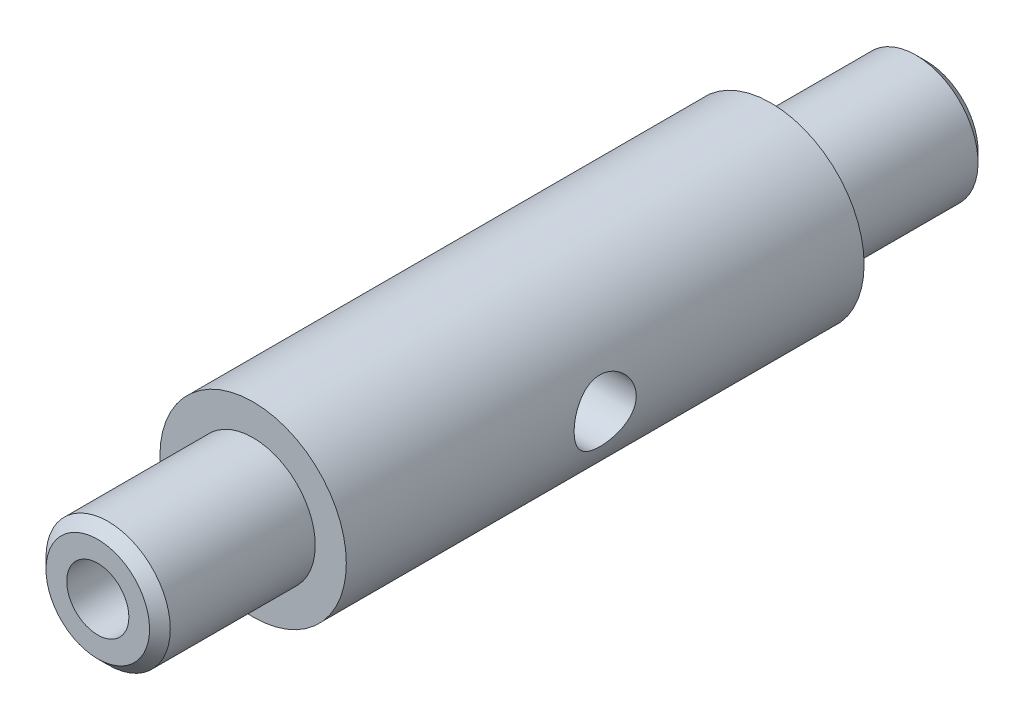
ISO-10303-21;
HEADER;
FILE_DESCRIPTION(('STEP AP214'),'2;1');
FILE_NAME('part.step','',(''),(''),'','','');
FILE_SCHEMA(('AUTOMOTIVE_DESIGN { 1 0 10303 214 1 1 1 1 }'));
ENDSEC;
DATA;
#1=APPLICATION_CONTEXT('core data for automotive mechanical design processes');
#2=APPLICATION_PROTOCOL_DEFINITION('international standard','automotive_design',2000,#1);
#3=PRODUCT_CONTEXT('',#1,'mechanical');
#4=PRODUCT('Part','Part','',(#3));
#5=PRODUCT_RELATED_PRODUCT_CATEGORY('part','',(#4));
#6=PRODUCT_DEFINITION_FORMATION('','',#4);
#7=PRODUCT_DEFINITION_CONTEXT('part definition',#1,'design');
#8=PRODUCT_DEFINITION('design','',#6,#7);
#9=PRODUCT_DEFINITION_SHAPE('','',#8);
#10=(LENGTH_UNIT() NAMED_UNIT(*) SI_UNIT(.MILLI.,.METRE.));
#11=(NAMED_UNIT(*) PLANE_ANGLE_UNIT() SI_UNIT($,.RADIAN.));
#12=(NAMED_UNIT(*) SI_UNIT($,.STERADIAN.) SOLID_ANGLE_UNIT());
#13=UNCERTAINTY_MEASURE_WITH_UNIT(LENGTH_MEASURE(1.E-05),#10,'distance_accuracy_value','');
#14=(GEOMETRIC_REPRESENTATION_CONTEXT(3) GLOBAL_UNCERTAINTY_ASSIGNED_CONTEXT((#13)) GLOBAL_UNIT_ASSIGNED_CONTEXT((#10,
#11,#12)) REPRESENTATION_CONTEXT('',''));
#15=CARTESIAN_POINT('',(0.,0.,0.));
#16=DIRECTION('',(0.,0.,1.));
#17=DIRECTION('',(1.,0.,0.));
#18=AXIS2_PLACEMENT_3D('',#15,#16,#17);
#19=CARTESIAN_POINT('',(0.,0.,0.));
#20=DIRECTION('',(0.,0.,1.));
#21=DIRECTION('',(1.,0.,0.));
#22=AXIS2_PLACEMENT_3D('',#19,#20,#21);
#23=CYLINDRICAL_SURFACE('',#22,3.00000000000001);
#24=CARTESIAN_POINT('',(0.,0.,0.));
#25=DIRECTION('',(0.,0.,1.));
#26=DIRECTION('',(1.,0.,0.));
#27=AXIS2_PLACEMENT_3D('',#24,#25,#26);
#28=CIRCLE('',#27,3.00000000000001);
#29=CARTESIAN_POINT('',(3.00000000000001,0.,0.));
#30=VERTEX_POINT('',#29);
#31=EDGE_CURVE('E155',#30,#30,#28,.T.);
#32=ORIENTED_EDGE('',*,*,#31,.T.);
#33=EDGE_LOOP('',(#32));
#34=FACE_BOUND('',#33,.T.);
#35=CARTESIAN_POINT('',(0.,0.,-40.));
#36=DIRECTION('',(-0.707106781186547,0.,0.707106781186547));
#37=DIRECTION('',(0.707106781186547,0.,0.707106781186547));
#38=AXIS2_PLACEMENT_3D('',#35,#36,#37);
#39=ELLIPSE('',#38,4.24264068711929,3.00000000000001);
#40=CARTESIAN_POINT('',(0.,3.00000000000001,-40.));
#41=VERTEX_POINT('',#40);
#42=CARTESIAN_POINT('',(0.,-3.00000000000001,-40.));
#43=VERTEX_POINT('',#42);
#44=EDGE_CURVE('E56',#41,#43,#39,.F.);
#45=ORIENTED_EDGE('',*,*,#44,.T.);
#46=CARTESIAN_POINT('',(0.,0.,-40.));
#47=DIRECTION('',(0.707106781186547,0.,0.707106781186547));
#48=DIRECTION('',(-0.707106781186547,0.,0.707106781186547));
#49=AXIS2_PLACEMENT_3D('',#46,#47,#48);
#50=ELLIPSE('',#49,4.24264068711929,3.00000000000001);
#51=EDGE_CURVE('E64',#43,#41,#50,.F.);
#52=ORIENTED_EDGE('',*,*,#51,.T.);
#53=EDGE_LOOP('',(#45,#52));
#54=FACE_BOUND('',#53,.T.);
#55=ADVANCED_FACE('F41',(#34,#54),#23,.F.);
#56=CARTESIAN_POINT('',(0.,0.,0.));
#57=DIRECTION('',(0.,0.,1.));
#58=DIRECTION('',(0.,-1.,0.));
#59=AXIS2_PLACEMENT_3D('',#56,#57,#58);
#60=PLANE('',#59);
#61=CARTESIAN_POINT('',(0.,0.,0.));
#62=DIRECTION('',(0.,0.,1.));
#63=DIRECTION('',(0.,-1.,0.));
#64=AXIS2_PLACEMENT_3D('',#61,#62,#63);
#65=CIRCLE('',#64,5.00000000000001);
#66=CARTESIAN_POINT('',(0.,-5.00000000000001,0.));
#67=VERTEX_POINT('',#66);
#68=EDGE_CURVE('E11',#67,#67,#65,.T.);
#69=ORIENTED_EDGE('',*,*,#68,.T.);
#70=EDGE_LOOP('',(#69));
#71=FACE_BOUND('',#70,.T.);
#72=ORIENTED_EDGE('',*,*,#31,.F.);
#73=EDGE_LOOP('',(#72));
#74=FACE_BOUND('',#73,.T.);
#75=ADVANCED_FACE('F98',(#71,#74),#60,.T.);
#76=CARTESIAN_POINT('',(0.,0.,-80.));
#77=DIRECTION('',(0.,0.,-1.));
#78=DIRECTION('',(0.,1.,0.));
#79=AXIS2_PLACEMENT_3D('',#76,#77,#78);
#80=CYLINDRICAL_SURFACE('',#79,6.);
#81=CARTESIAN_POINT('',(0.,0.,-0.999999999999987));
#82=DIRECTION('',(0.,0.,1.));
#83=DIRECTION('',(0.,-1.,0.));
#84=AXIS2_PLACEMENT_3D('',#81,#82,#83);
#85=CIRCLE('',#84,6.);
#86=CARTESIAN_POINT('',(0.,-6.,-0.999999999999987));
#87=VERTEX_POINT('',#86);
#88=EDGE_CURVE('E50',#87,#87,#85,.F.);
#89=ORIENTED_EDGE('',*,*,#88,.T.);
#90=EDGE_LOOP('',(#89));
#91=FACE_BOUND('',#90,.T.);
#92=CARTESIAN_POINT('',(0.,0.,-15.));
#93=DIRECTION('',(0.,0.,-1.));
#94=DIRECTION('',(0.,1.,0.));
#95=AXIS2_PLACEMENT_3D('',#92,#93,#94);
#96=CIRCLE('',#95,6.);
#97=CARTESIAN_POINT('',(0.,6.,-15.));
#98=VERTEX_POINT('',#97);
#99=EDGE_CURVE('E71',#98,#98,#96,.T.);
#100=ORIENTED_EDGE('',*,*,#99,.F.);
#101=EDGE_LOOP('',(#100));
#102=FACE_BOUND('',#101,.T.);
#103=ADVANCED_FACE('F86',(#91,#102),#80,.T.);
#104=CARTESIAN_POINT('',(0.,6.,-15.));
#105=DIRECTION('',(0.,0.,1.));
#106=DIRECTION('',(0.,-1.,0.));
#107=AXIS2_PLACEMENT_3D('',#104,#105,#106);
#108=PLANE('',#107);
#109=ORIENTED_EDGE('',*,*,#99,.T.);
#110=EDGE_LOOP('',(#109));
#111=FACE_BOUND('',#110,.T.);
#112=CARTESIAN_POINT('',(0.,0.,-15.));
#113=DIRECTION('',(0.,0.,-1.));
#114=DIRECTION('',(0.,1.,0.));
#115=AXIS2_PLACEMENT_3D('',#112,#113,#114);
#116=CIRCLE('',#115,8.99999999999999);
#117=CARTESIAN_POINT('',(0.,8.99999999999999,-15.));
#118=VERTEX_POINT('',#117);
#119=EDGE_CURVE('E167',#118,#118,#116,.T.);
#120=ORIENTED_EDGE('',*,*,#119,.F.);
#121=EDGE_LOOP('',(#120));
#122=FACE_BOUND('',#121,.T.);
#123=ADVANCED_FACE('F139',(#111,#122),#108,.T.);
#124=CARTESIAN_POINT('',(0.,0.,-80.));
#125=DIRECTION('',(0.,0.,-1.));
#126=DIRECTION('',(0.,1.,0.));
#127=AXIS2_PLACEMENT_3D('',#124,#125,#126);
#128=CYLINDRICAL_SURFACE('',#127,8.99999999999999);
#129=CARTESIAN_POINT('',(-8.99999999999999,0.,-43.));
#130=CARTESIAN_POINT('',(-9.00000045902831,-0.16369008866017,-43.0000007611949));
#131=CARTESIAN_POINT('',(-8.99549308522634,-0.32737558361565,-42.9865592016184));
#132=CARTESIAN_POINT('',(-8.97795630609841,-0.649925282618917,-42.9333126735484));
#133=CARTESIAN_POINT('',(-8.96492601606457,-0.808788984356453,-42.8935049681532));
#134=CARTESIAN_POINT('',(-8.93175923719327,-1.11699836850533,-42.7890422698479));
#135=CARTESIAN_POINT('',(-8.91163463192559,-1.2663594776581,-42.7244288126222));
#136=CARTESIAN_POINT('',(-8.86633337152024,-1.55212481041597,-42.572376481485));
#137=CARTESIAN_POINT('',(-8.84115572003333,-1.68852647087612,-42.4849331049922));
#138=CARTESIAN_POINT('',(-8.78742283329014,-1.9492250250668,-42.2865225854237));
#139=CARTESIAN_POINT('',(-8.75878669391354,-2.07301110089493,-42.1749062972185));
#140=CARTESIAN_POINT('',(-8.70180944349364,-2.30049807810625,-41.9326985358803));
#141=CARTESIAN_POINT('',(-8.67346839871647,-2.40419455646839,-41.8021028952145));
#142=CARTESIAN_POINT('',(-8.61939997431821,-2.59147482668358,-41.5210446544106));
#143=CARTESIAN_POINT('',(-8.59377117827064,-2.67439457466309,-41.3701187808036));
#144=CARTESIAN_POINT('',(-8.54925916255802,-2.81345662163316,-41.0554717166244));
#145=CARTESIAN_POINT('',(-8.53037388482236,-2.8696070921603,-40.8917544485118));
#146=CARTESIAN_POINT('',(-8.50233909808131,-2.95162038452749,-40.5619803355099));
#147=CARTESIAN_POINT('',(-8.49288287308833,-2.97844034481531,-40.3961883745328));
#148=CARTESIAN_POINT('',(-8.48386969888522,-3.00402337000343,-40.0622087375324));
#149=CARTESIAN_POINT('',(-8.48430969068189,-3.00279510481416,-39.8940218178724));
#150=CARTESIAN_POINT('',(-8.4947704502454,-2.97305971111026,-39.5681901086679));
#151=CARTESIAN_POINT('',(-8.50435247602598,-2.94580173950099,-39.4104147912429));
#152=CARTESIAN_POINT('',(-8.53129973173652,-2.86681848854825,-39.1018197411795));
#153=CARTESIAN_POINT('',(-8.54866589352322,-2.81509027977562,-38.9510008436948));
#154=CARTESIAN_POINT('',(-8.58953733393745,-2.68781717418063,-38.6577617512256));
#155=CARTESIAN_POINT('',(-8.61313697379351,-2.61190214612179,-38.5155159235914));
#156=CARTESIAN_POINT('',(-8.66377675727179,-2.43866731890942,-38.2453872751608));
#157=CARTESIAN_POINT('',(-8.6908178937139,-2.34134133709202,-38.1175086191999));
#158=CARTESIAN_POINT('',(-8.74701987503222,-2.12204799804671,-37.8727252055177));
#159=CARTESIAN_POINT('',(-8.77621768064528,-1.99905945022894,-37.7567419164728));
#160=CARTESIAN_POINT('',(-8.83220815161109,-1.73501870991019,-37.5468062000098));
#161=CARTESIAN_POINT('',(-8.85900058614201,-1.59396478698245,-37.4528558855065));
#162=CARTESIAN_POINT('',(-8.9075132381338,-1.29584283913881,-37.2889110992948));
#163=CARTESIAN_POINT('',(-8.92918050024117,-1.13862982924901,-37.2191635259778));
#164=CARTESIAN_POINT('',(-8.96461701433304,-0.813807250093526,-37.1073904781329));
#165=CARTESIAN_POINT('',(-8.97838900964637,-0.646201314464865,-37.0653553737297));
#166=CARTESIAN_POINT('',(-8.9960288121432,-0.313151488587916,-37.0118330019329));
#167=CARTESIAN_POINT('',(-9.00030005501183,-0.147928799594542,-36.9991005724817));
#168=CARTESIAN_POINT('',(-8.99966708084481,0.18232520988071,-37.0009980207954));
#169=CARTESIAN_POINT('',(-8.99476441258086,0.34735655795895,-37.0156232799396));
#170=CARTESIAN_POINT('',(-8.97660074151312,0.667559598912767,-37.0708357232079));
#171=CARTESIAN_POINT('',(-8.96358596133576,0.822878420504531,-37.1106586181485));
#172=CARTESIAN_POINT('',(-8.93075540490209,1.12456787573872,-37.2141803334002));
#173=CARTESIAN_POINT('',(-8.91093876140024,1.27093736552582,-37.2778821984034));
#174=CARTESIAN_POINT('',(-8.86586793861868,1.55486488917982,-37.4292112955224));
#175=CARTESIAN_POINT('',(-8.84048444267357,1.69208987765144,-37.5174237798495));
#176=CARTESIAN_POINT('',(-8.78715761748787,1.95019449040676,-37.7145824500404));
#177=CARTESIAN_POINT('',(-8.75921350781482,2.07106910338673,-37.8235349680953));
#178=CARTESIAN_POINT('',(-8.70230543941333,2.2987575234189,-38.0649362530198));
#179=CARTESIAN_POINT('',(-8.67335283262283,2.40468290773731,-38.1982276807806));
#180=CARTESIAN_POINT('',(-8.61899919884125,2.59277256697072,-38.4813147034327));
#181=CARTESIAN_POINT('',(-8.59359820146006,2.67493664379304,-38.6311104359022));
#182=CARTESIAN_POINT('',(-8.5494717537415,2.81279079124909,-38.9430190458697));
#183=CARTESIAN_POINT('',(-8.53073282378936,2.86853439649506,-39.1051062375063));
#184=CARTESIAN_POINT('',(-8.50232496919348,2.95168400027807,-39.4371359501324));
#185=CARTESIAN_POINT('',(-8.49265195870917,2.97910276486182,-39.607074896213));
#186=CARTESIAN_POINT('',(-8.48393576622531,3.00382884743203,-39.9405912881227));
#187=CARTESIAN_POINT('',(-8.48437200772245,3.0026107719252,-40.1040470208605));
#188=CARTESIAN_POINT('',(-8.49453809471601,2.97372688034608,-40.4282952247662));
#189=CARTESIAN_POINT('',(-8.50426738708084,2.94606263837576,-40.5890878538653));
#190=CARTESIAN_POINT('',(-8.53153572914674,2.86611543938804,-40.9004069890074));
#191=CARTESIAN_POINT('',(-8.54892294067432,2.81431003804654,-41.0510704750135));
#192=CARTESIAN_POINT('',(-8.58949196455405,2.68793809727924,-41.3416822208148));
#193=CARTESIAN_POINT('',(-8.61267506290179,2.61336650566142,-41.481628093564));
#194=CARTESIAN_POINT('',(-8.66348487678138,2.43978207775029,-41.7534510097687));
#195=CARTESIAN_POINT('',(-8.6912613492641,2.33984472829374,-41.8847095056952));
#196=CARTESIAN_POINT('',(-8.74750068849758,2.11992864940694,-42.1290694401526));
#197=CARTESIAN_POINT('',(-8.77596374737116,1.99994425335444,-42.2421657270642));
#198=CARTESIAN_POINT('',(-8.83170091576632,1.73772467076206,-42.4514332368675));
#199=CARTESIAN_POINT('',(-8.85888545403769,1.59480454049919,-42.546773043253));
#200=CARTESIAN_POINT('',(-8.90777973517835,1.29407207221988,-42.7119712865519));
#201=CARTESIAN_POINT('',(-8.92949087723789,1.13626355439705,-42.7818362377661));
#202=CARTESIAN_POINT('',(-8.96416545205625,0.817480941602931,-42.891164897466));
#203=CARTESIAN_POINT('',(-8.97747637267567,0.656963273029229,-42.9318473987901));
#204=CARTESIAN_POINT('',(-8.99539221192664,0.330961248030742,-42.9862608420314));
#205=CARTESIAN_POINT('',(-8.99999953595714,0.16547827670624,-42.9999992304896));
#206=CARTESIAN_POINT('',(-8.99999999999999,0.,-43.));
#207=B_SPLINE_CURVE_WITH_KNOTS('',3,(#129,#130,#131,#132,#133,#134,#135,#136,#137,#138,#139,
#140,#141,#142,#143,#144,#145,#146,#147,#148,#149,#150,#151,#152,#153,#154,#155,#156,#157,#158,
#159,#160,#161,#162,#163,#164,#165,#166,#167,#168,#169,#170,#171,#172,#173,#174,#175,#176,#177,
#178,#179,#180,#181,#182,#183,#184,#185,#186,#187,#188,#189,#190,#191,#192,#193,#194,#195,#196,
#197,#198,#199,#200,#201,#202,#203,#204,#205,#206),.UNSPECIFIED.,.T.,.F.,(4,2,2,2,2,2,2,2,2,2,2,
2,2,2,2,2,2,2,2,2,2,2,2,2,2,2,2,2,2,2,2,2,2,2,2,2,2,2,4),(0.,0.490461318078033,
0.980973555802562,1.47066801861082,1.9604591333973,2.46554052848268,2.97073299862591,
3.49045154470411,4.010011340785,4.51205777225521,5.01394901962457,5.49290479653841,
5.97191792566446,6.45864513465392,6.94551307674622,7.45779917434101,7.97013437899855,
8.48755216951073,9.00479006631625,9.49960749525509,9.9943413949253,10.4747447393464,
10.9552093585231,11.4483119953121,11.9415654246567,12.4572306864226,12.9729002470499,
13.4875204148031,14.0019085411752,14.4898699819278,14.9778023805413,15.4564676124125,
15.9352391452793,16.4349020007542,16.9347063337134,17.453989825053,17.9731404345737,
18.4690967512144,18.9649159811442),.UNSPECIFIED.);
#208=CARTESIAN_POINT('',(-8.99999999999999,0.,-43.));
#209=VERTEX_POINT('',#208);
#210=EDGE_CURVE('E149',#209,#209,#207,.T.);
#211=ORIENTED_EDGE('',*,*,#210,.F.);
#212=EDGE_LOOP('',(#211));
#213=FACE_BOUND('',#212,.T.);
#214=CARTESIAN_POINT('',(8.99999999999999,0.,-43.));
#215=CARTESIAN_POINT('',(9.00000045902831,0.163690088660169,-43.0000007611949));
#216=CARTESIAN_POINT('',(8.99549308522634,0.32737558361565,-42.9865592016184));
#217=CARTESIAN_POINT('',(8.97795630609841,0.649925282618916,-42.9333126735484));
#218=CARTESIAN_POINT('',(8.96492601606457,0.808788984356453,-42.8935049681532));
#219=CARTESIAN_POINT('',(8.93175923719327,1.11699836850533,-42.7890422698479));
#220=CARTESIAN_POINT('',(8.91163463192559,1.2663594776581,-42.7244288126222));
#221=CARTESIAN_POINT('',(8.86633337152024,1.55212481041597,-42.572376481485));
#222=CARTESIAN_POINT('',(8.84115572003333,1.68852647087612,-42.4849331049922));
#223=CARTESIAN_POINT('',(8.78742283329014,1.9492250250668,-42.2865225854237));
#224=CARTESIAN_POINT('',(8.75878669391354,2.07301110089493,-42.1749062972185));
#225=CARTESIAN_POINT('',(8.70180944349364,2.30049807810625,-41.9326985358803));
#226=CARTESIAN_POINT('',(8.67346839871647,2.40419455646839,-41.8021028952145));
#227=CARTESIAN_POINT('',(8.61939997431821,2.59147482668358,-41.5210446544106));
#228=CARTESIAN_POINT('',(8.59377117827064,2.67439457466309,-41.3701187808036));
#229=CARTESIAN_POINT('',(8.54925916255802,2.81345662163316,-41.0554717166244));
#230=CARTESIAN_POINT('',(8.53037388482236,2.8696070921603,-40.8917544485118));
#231=CARTESIAN_POINT('',(8.50233909808131,2.95162038452749,-40.5619803355099));
#232=CARTESIAN_POINT('',(8.49288287308833,2.97844034481531,-40.3961883745328));
#233=CARTESIAN_POINT('',(8.48386969888522,3.00402337000343,-40.0622087375324));
#234=CARTESIAN_POINT('',(8.48430969068189,3.00279510481416,-39.8940218178724));
#235=CARTESIAN_POINT('',(8.4947704502454,2.97305971111026,-39.5681901086679));
#236=CARTESIAN_POINT('',(8.50435247602598,2.94580173950099,-39.4104147912429));
#237=CARTESIAN_POINT('',(8.53129973173652,2.86681848854825,-39.1018197411795));
#238=CARTESIAN_POINT('',(8.54866589352322,2.81509027977562,-38.9510008436948));
#239=CARTESIAN_POINT('',(8.58953733393745,2.68781717418063,-38.6577617512256));
#240=CARTESIAN_POINT('',(8.61313697379351,2.61190214612179,-38.5155159235914));
#241=CARTESIAN_POINT('',(8.66377675727179,2.43866731890942,-38.2453872751608));
#242=CARTESIAN_POINT('',(8.6908178937139,2.34134133709202,-38.1175086191999));
#243=CARTESIAN_POINT('',(8.74701987503222,2.12204799804671,-37.8727252055177));
#244=CARTESIAN_POINT('',(8.77621768064528,1.99905945022894,-37.7567419164728));
#245=CARTESIAN_POINT('',(8.83220815161109,1.73501870991019,-37.5468062000098));
#246=CARTESIAN_POINT('',(8.85900058614201,1.59396478698245,-37.4528558855065));
#247=CARTESIAN_POINT('',(8.9075132381338,1.29584283913881,-37.2889110992948));
#248=CARTESIAN_POINT('',(8.92918050024117,1.13862982924901,-37.2191635259778));
#249=CARTESIAN_POINT('',(8.96461701433304,0.813807250093527,-37.1073904781329));
#250=CARTESIAN_POINT('',(8.97838900964637,0.646201314464866,-37.0653553737297));
#251=CARTESIAN_POINT('',(8.9960288121432,0.313151488587917,-37.0118330019329));
#252=CARTESIAN_POINT('',(9.00030005501183,0.147928799594542,-36.9991005724817));
#253=CARTESIAN_POINT('',(8.99966708084481,-0.18232520988071,-37.0009980207954));
#254=CARTESIAN_POINT('',(8.99476441258086,-0.34735655795895,-37.0156232799396));
#255=CARTESIAN_POINT('',(8.97660074151312,-0.667559598912766,-37.0708357232079));
#256=CARTESIAN_POINT('',(8.96358596133576,-0.822878420504531,-37.1106586181485));
#257=CARTESIAN_POINT('',(8.93075540490209,-1.12456787573872,-37.2141803334002));
#258=CARTESIAN_POINT('',(8.91093876140025,-1.27093736552582,-37.2778821984034));
#259=CARTESIAN_POINT('',(8.86586793861869,-1.55486488917982,-37.4292112955224));
#260=CARTESIAN_POINT('',(8.84048444267357,-1.69208987765144,-37.5174237798495));
#261=CARTESIAN_POINT('',(8.78715761748787,-1.95019449040676,-37.7145824500404));
#262=CARTESIAN_POINT('',(8.75921350781482,-2.07106910338673,-37.8235349680953));
#263=CARTESIAN_POINT('',(8.70230543941333,-2.2987575234189,-38.0649362530198));
#264=CARTESIAN_POINT('',(8.67335283262283,-2.40468290773731,-38.1982276807806));
#265=CARTESIAN_POINT('',(8.61899919884125,-2.59277256697072,-38.4813147034327));
#266=CARTESIAN_POINT('',(8.59359820146006,-2.67493664379304,-38.6311104359022));
#267=CARTESIAN_POINT('',(8.5494717537415,-2.81279079124909,-38.9430190458697));
#268=CARTESIAN_POINT('',(8.53073282378936,-2.86853439649506,-39.1051062375063));
#269=CARTESIAN_POINT('',(8.50232496919348,-2.95168400027807,-39.4371359501324));
#270=CARTESIAN_POINT('',(8.49265195870917,-2.97910276486182,-39.607074896213));
#271=CARTESIAN_POINT('',(8.48393576622531,-3.00382884743203,-39.9405912881227));
#272=CARTESIAN_POINT('',(8.48437200772245,-3.0026107719252,-40.1040470208605));
#273=CARTESIAN_POINT('',(8.49453809471601,-2.97372688034608,-40.4282952247662));
#274=CARTESIAN_POINT('',(8.50426738708084,-2.94606263837576,-40.5890878538653));
#275=CARTESIAN_POINT('',(8.53153572914674,-2.86611543938804,-40.9004069890074));
#276=CARTESIAN_POINT('',(8.54892294067432,-2.81431003804654,-41.0510704750135));
#277=CARTESIAN_POINT('',(8.58949196455405,-2.68793809727924,-41.3416822208148));
#278=CARTESIAN_POINT('',(8.61267506290179,-2.61336650566142,-41.481628093564));
#279=CARTESIAN_POINT('',(8.66348487678138,-2.43978207775029,-41.7534510097687));
#280=CARTESIAN_POINT('',(8.6912613492641,-2.33984472829374,-41.8847095056952));
#281=CARTESIAN_POINT('',(8.74750068849758,-2.11992864940694,-42.1290694401526));
#282=CARTESIAN_POINT('',(8.77596374737116,-1.99994425335444,-42.2421657270642));
#283=CARTESIAN_POINT('',(8.83170091576632,-1.73772467076206,-42.4514332368675));
#284=CARTESIAN_POINT('',(8.85888545403769,-1.59480454049918,-42.546773043253));
#285=CARTESIAN_POINT('',(8.90777973517835,-1.29407207221987,-42.711971286552));
#286=CARTESIAN_POINT('',(8.92949087723789,-1.13626355439704,-42.7818362377661));
#287=CARTESIAN_POINT('',(8.96416545205625,-0.817480941602926,-42.891164897466));
#288=CARTESIAN_POINT('',(8.97747637267567,-0.656963273029224,-42.9318473987901));
#289=CARTESIAN_POINT('',(8.99539221192664,-0.33096124803074,-42.9862608420314));
#290=CARTESIAN_POINT('',(8.99999953595714,-0.165478276706239,-42.9999992304896));
#291=CARTESIAN_POINT('',(8.99999999999999,0.,-43.));
#292=B_SPLINE_CURVE_WITH_KNOTS('',3,(#214,#215,#216,#217,#218,#219,#220,#221,#222,#223,#224,
#225,#226,#227,#228,#229,#230,#231,#232,#233,#234,#235,#236,#237,#238,#239,#240,#241,#242,#243,
#244,#245,#246,#247,#248,#249,#250,#251,#252,#253,#254,#255,#256,#257,#258,#259,#260,#261,#262,
#263,#264,#265,#266,#267,#268,#269,#270,#271,#272,#273,#274,#275,#276,#277,#278,#279,#280,#281,
#282,#283,#284,#285,#286,#287,#288,#289,#290,#291),.UNSPECIFIED.,.T.,.F.,(4,2,2,2,2,2,2,2,2,2,2,
2,2,2,2,2,2,2,2,2,2,2,2,2,2,2,2,2,2,2,2,2,2,2,2,2,2,2,4),(0.,0.490461318078033,
0.980973555802562,1.47066801861082,1.9604591333973,2.46554052848268,2.97073299862591,
3.49045154470411,4.010011340785,4.51205777225521,5.01394901962457,5.49290479653841,
5.97191792566446,6.45864513465392,6.94551307674622,7.45779917434101,7.97013437899855,
8.48755216951073,9.00479006631625,9.49960749525509,9.9943413949253,10.4747447393464,
10.9552093585231,11.4483119953121,11.9415654246567,12.4572306864226,12.9729002470499,
13.4875204148031,14.0019085411752,14.4898699819277,14.9778023805413,15.4564676124125,
15.9352391452793,16.4349020007541,16.9347063337134,17.453989825053,17.9731404345737,
18.4690967512144,18.9649159811442),.UNSPECIFIED.);
#293=CARTESIAN_POINT('',(8.99999999999999,0.,-43.));
#294=VERTEX_POINT('',#293);
#295=EDGE_CURVE('E144',#294,#294,#292,.T.);
#296=ORIENTED_EDGE('',*,*,#295,.F.);
#297=EDGE_LOOP('',(#296));
#298=FACE_BOUND('',#297,.T.);
#299=ORIENTED_EDGE('',*,*,#119,.T.);
#300=EDGE_LOOP('',(#299));
#301=FACE_BOUND('',#300,.T.);
#302=CARTESIAN_POINT('',(0.,0.,-65.));
#303=DIRECTION('',(0.,0.,-1.));
#304=DIRECTION('',(0.,1.,0.));
#305=AXIS2_PLACEMENT_3D('',#302,#303,#304);
#306=CIRCLE('',#305,8.99999999999999);
#307=CARTESIAN_POINT('',(0.,8.99999999999999,-65.));
#308=VERTEX_POINT('',#307);
#309=EDGE_CURVE('E164',#308,#308,#306,.T.);
#310=ORIENTED_EDGE('',*,*,#309,.F.);
#311=EDGE_LOOP('',(#310));
#312=FACE_BOUND('',#311,.T.);
#313=ADVANCED_FACE('F135',(#213,#298,#301,#312),#128,.T.);
#314=CARTESIAN_POINT('',(0.,8.99999999999999,-65.));
#315=DIRECTION('',(0.,0.,-1.));
#316=DIRECTION('',(0.,1.,0.));
#317=AXIS2_PLACEMENT_3D('',#314,#315,#316);
#318=PLANE('',#317);
#319=ORIENTED_EDGE('',*,*,#309,.T.);
#320=EDGE_LOOP('',(#319));
#321=FACE_BOUND('',#320,.T.);
#322=CARTESIAN_POINT('',(0.,0.,-65.));
#323=DIRECTION('',(0.,0.,-1.));
#324=DIRECTION('',(0.,1.,0.));
#325=AXIS2_PLACEMENT_3D('',#322,#323,#324);
#326=CIRCLE('',#325,6.);
#327=CARTESIAN_POINT('',(0.,6.,-65.));
#328=VERTEX_POINT('',#327);
#329=EDGE_CURVE('E161',#328,#328,#326,.T.);
#330=ORIENTED_EDGE('',*,*,#329,.F.);
#331=EDGE_LOOP('',(#330));
#332=FACE_BOUND('',#331,.T.);
#333=ADVANCED_FACE('F132',(#321,#332),#318,.T.);
#334=CARTESIAN_POINT('',(0.,0.,-80.));
#335=DIRECTION('',(0.,0.,-1.));
#336=DIRECTION('',(0.,1.,0.));
#337=AXIS2_PLACEMENT_3D('',#334,#335,#336);
#338=CYLINDRICAL_SURFACE('',#337,6.);
#339=CARTESIAN_POINT('',(0.,0.,-79.));
#340=DIRECTION('',(0.,0.,-1.));
#341=DIRECTION('',(0.,1.,0.));
#342=AXIS2_PLACEMENT_3D('',#339,#340,#341);
#343=CIRCLE('',#342,6.);
#344=CARTESIAN_POINT('',(0.,6.,-79.));
#345=VERTEX_POINT('',#344);
#346=EDGE_CURVE('E81',#345,#345,#343,.F.);
#347=ORIENTED_EDGE('',*,*,#346,.T.);
#348=EDGE_LOOP('',(#347));
#349=FACE_BOUND('',#348,.T.);
#350=ORIENTED_EDGE('',*,*,#329,.T.);
#351=EDGE_LOOP('',(#350));
#352=FACE_BOUND('',#351,.T.);
#353=ADVANCED_FACE('F128',(#349,#352),#338,.T.);
#354=CARTESIAN_POINT('',(0.,6.,-80.));
#355=DIRECTION('',(0.,0.,-1.));
#356=DIRECTION('',(0.,1.,0.));
#357=AXIS2_PLACEMENT_3D('',#354,#355,#356);
#358=PLANE('',#357);
#359=CARTESIAN_POINT('',(0.,0.,-80.));
#360=DIRECTION('',(0.,0.,-1.));
#361=DIRECTION('',(0.,1.,0.));
#362=AXIS2_PLACEMENT_3D('',#359,#360,#361);
#363=CIRCLE('',#362,4.99999999999998);
#364=CARTESIAN_POINT('',(0.,4.99999999999998,-80.));
#365=VERTEX_POINT('',#364);
#366=EDGE_CURVE('E73',#365,#365,#363,.T.);
#367=ORIENTED_EDGE('',*,*,#366,.T.);
#368=EDGE_LOOP('',(#367));
#369=FACE_BOUND('',#368,.T.);
#370=ADVANCED_FACE('F122',(#369),#358,.T.);
#371=CARTESIAN_POINT('',(-8.99999999999999,0.,-40.));
#372=DIRECTION('',(1.,0.,0.));
#373=DIRECTION('',(0.,0.,-1.));
#374=AXIS2_PLACEMENT_3D('',#371,#372,#373);
#375=CYLINDRICAL_SURFACE('',#374,3.);
#376=ORIENTED_EDGE('',*,*,#295,.T.);
#377=EDGE_LOOP('',(#376));
#378=FACE_BOUND('',#377,.T.);
#379=ORIENTED_EDGE('',*,*,#44,.F.);
#380=CARTESIAN_POINT('',(0.,0.,-40.));
#381=DIRECTION('',(0.707106781186547,0.,0.707106781186547));
#382=DIRECTION('',(-0.707106781186547,0.,0.707106781186547));
#383=AXIS2_PLACEMENT_3D('',#380,#381,#382);
#384=ELLIPSE('',#383,4.24264068711929,3.00000000000001);
#385=EDGE_CURVE('E67',#43,#41,#384,.T.);
#386=ORIENTED_EDGE('',*,*,#385,.F.);
#387=EDGE_LOOP('',(#379,#386));
#388=FACE_BOUND('',#387,.T.);
#389=ADVANCED_FACE('F70',(#378,#388),#375,.F.);
#390=CARTESIAN_POINT('',(0.,0.,-45.));
#391=DIRECTION('',(0.,0.,-1.));
#392=DIRECTION('',(-1.,0.,0.));
#393=AXIS2_PLACEMENT_3D('',#390,#391,#392);
#394=PLANE('',#393);
#395=CARTESIAN_POINT('',(0.,0.,-45.));
#396=DIRECTION('',(0.,0.,1.));
#397=DIRECTION('',(1.,0.,0.));
#398=AXIS2_PLACEMENT_3D('',#395,#396,#397);
#399=CIRCLE('',#398,3.00000000000001);
#400=CARTESIAN_POINT('',(3.00000000000001,0.,-45.));
#401=VERTEX_POINT('',#400);
#402=EDGE_CURVE('E159',#401,#401,#399,.T.);
#403=ORIENTED_EDGE('',*,*,#402,.T.);
#404=EDGE_LOOP('',(#403));
#405=FACE_BOUND('',#404,.T.);
#406=ADVANCED_FACE('F112',(#405),#394,.F.);
#407=CARTESIAN_POINT('',(0.,0.,-40.));
#408=DIRECTION('',(-0.707106781186547,0.,0.707106781186547));
#409=DIRECTION('',(0.707106781186547,0.,0.707106781186547));
#410=AXIS2_PLACEMENT_3D('',#407,#408,#409);
#411=ELLIPSE('',#410,4.24264068711929,3.00000000000001);
#412=EDGE_CURVE('E62',#41,#43,#411,.T.);
#413=ORIENTED_EDGE('',*,*,#412,.T.);
#414=ORIENTED_EDGE('',*,*,#385,.T.);
#415=EDGE_LOOP('',(#413,#414));
#416=FACE_BOUND('',#415,.T.);
#417=ORIENTED_EDGE('',*,*,#402,.F.);
#418=EDGE_LOOP('',(#417));
#419=FACE_BOUND('',#418,.T.);
#420=ADVANCED_FACE('F75',(#416,#419),#23,.F.);
#421=ORIENTED_EDGE('',*,*,#210,.T.);
#422=EDGE_LOOP('',(#421));
#423=FACE_BOUND('',#422,.T.);
#424=ORIENTED_EDGE('',*,*,#412,.F.);
#425=ORIENTED_EDGE('',*,*,#51,.F.);
#426=EDGE_LOOP('',(#424,#425));
#427=FACE_BOUND('',#426,.T.);
#428=ADVANCED_FACE('F63',(#423,#427),#375,.F.);
#429=CARTESIAN_POINT('',(0.,0.,-80.));
#430=DIRECTION('',(0.,0.,1.));
#431=DIRECTION('',(0.,-1.,0.));
#432=AXIS2_PLACEMENT_3D('',#429,#430,#431);
#433=CONICAL_SURFACE('',#432,4.99999999999998,0.785398163397449);
#434=ORIENTED_EDGE('',*,*,#346,.F.);
#435=EDGE_LOOP('',(#434));
#436=FACE_BOUND('',#435,.T.);
#437=ORIENTED_EDGE('',*,*,#366,.F.);
#438=EDGE_LOOP('',(#437));
#439=FACE_BOUND('',#438,.T.);
#440=ADVANCED_FACE('F90',(#436,#439),#433,.T.);
#441=CARTESIAN_POINT('',(0.,0.,-0.999999999999987));
#442=DIRECTION('',(0.,0.,-1.));
#443=DIRECTION('',(0.,1.,0.));
#444=AXIS2_PLACEMENT_3D('',#441,#442,#443);
#445=CONICAL_SURFACE('',#444,6.,0.785398163397449);
#446=ORIENTED_EDGE('',*,*,#68,.F.);
#447=EDGE_LOOP('',(#446));
#448=FACE_BOUND('',#447,.T.);
#449=ORIENTED_EDGE('',*,*,#88,.F.);
#450=EDGE_LOOP('',(#449));
#451=FACE_BOUND('',#450,.T.);
#452=ADVANCED_FACE('F44',(#448,#451),#445,.T.);
#453=CLOSED_SHELL('',(#55,#75,#103,#123,#313,#333,#353,#370,#389,#406,#420,#428,#440,#452));
#454=MANIFOLD_SOLID_BREP('B2',#453);
#455=ADVANCED_BREP_SHAPE_REPRESENTATION('',(#18,#454),#14);
#456=SHAPE_DEFINITION_REPRESENTATION(#9,#455);
ENDSEC;
END-ISO-10303-21;
